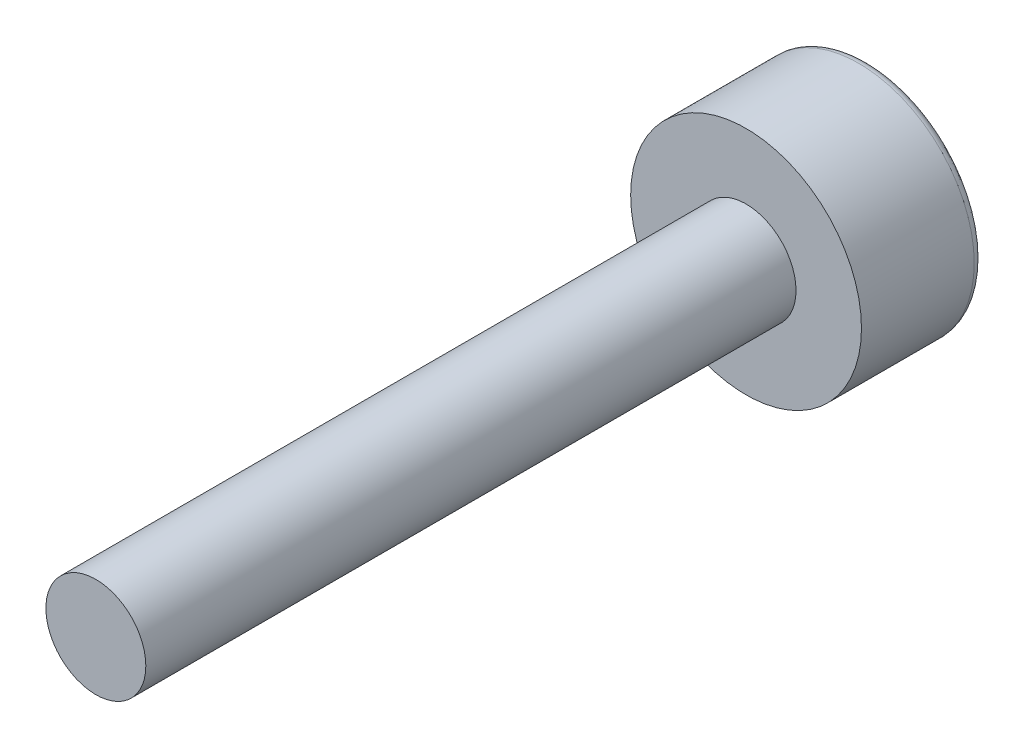
ISO-10303-21;
HEADER;
FILE_DESCRIPTION(('STEP AP214'),'2;1');
FILE_NAME('part.step','',(''),(''),'','','');
FILE_SCHEMA(('AUTOMOTIVE_DESIGN { 1 0 10303 214 1 1 1 1 }'));
ENDSEC;
DATA;
#1=APPLICATION_CONTEXT('core data for automotive mechanical design processes');
#2=APPLICATION_PROTOCOL_DEFINITION('international standard','automotive_design',2000,#1);
#3=PRODUCT_CONTEXT('',#1,'mechanical');
#4=PRODUCT('Part','Part','',(#3));
#5=PRODUCT_RELATED_PRODUCT_CATEGORY('part','',(#4));
#6=PRODUCT_DEFINITION_FORMATION('','',#4);
#7=PRODUCT_DEFINITION_CONTEXT('part definition',#1,'design');
#8=PRODUCT_DEFINITION('design','',#6,#7);
#9=PRODUCT_DEFINITION_SHAPE('','',#8);
#10=(LENGTH_UNIT() NAMED_UNIT(*) SI_UNIT(.MILLI.,.METRE.));
#11=(NAMED_UNIT(*) PLANE_ANGLE_UNIT() SI_UNIT($,.RADIAN.));
#12=(NAMED_UNIT(*) SI_UNIT($,.STERADIAN.) SOLID_ANGLE_UNIT());
#13=UNCERTAINTY_MEASURE_WITH_UNIT(LENGTH_MEASURE(1.E-05),#10,'distance_accuracy_value','');
#14=(GEOMETRIC_REPRESENTATION_CONTEXT(3) GLOBAL_UNCERTAINTY_ASSIGNED_CONTEXT((#13)) GLOBAL_UNIT_ASSIGNED_CONTEXT((#10,
#11,#12)) REPRESENTATION_CONTEXT('',''));
#15=CARTESIAN_POINT('',(0.,0.,0.));
#16=DIRECTION('',(0.,0.,1.));
#17=DIRECTION('',(1.,0.,0.));
#18=AXIS2_PLACEMENT_3D('',#15,#16,#17);
#19=CARTESIAN_POINT('',(1.443375672974,0.,-310.1));
#20=DIRECTION('',(0.,0.,1.));
#21=DIRECTION('',(0.,-1.,0.));
#22=AXIS2_PLACEMENT_3D('',#19,#20,#21);
#23=PLANE('',#22);
#24=DIRECTION('',(0.50000000000019,0.866025403784329,0.));
#25=VECTOR('',#24,1.);
#26=CARTESIAN_POINT('',(0.721687836487,-1.25,-310.1));
#27=LINE('',#26,#25);
#28=CARTESIAN_POINT('',(0.721687836487,-1.25,-310.1));
#29=VERTEX_POINT('',#28);
#30=CARTESIAN_POINT('',(1.443375672974,0.,-310.1));
#31=VERTEX_POINT('',#30);
#32=EDGE_CURVE('E177',#29,#31,#27,.T.);
#33=ORIENTED_EDGE('',*,*,#32,.F.);
#34=DIRECTION('',(1.,0.,0.));
#35=VECTOR('',#34,1.);
#36=CARTESIAN_POINT('',(-0.721687836487,-1.25,-310.1));
#37=LINE('',#36,#35);
#38=CARTESIAN_POINT('',(-0.721687836487,-1.25,-310.1));
#39=VERTEX_POINT('',#38);
#40=EDGE_CURVE('E83',#39,#29,#37,.T.);
#41=ORIENTED_EDGE('',*,*,#40,.F.);
#42=DIRECTION('',(0.50000000000019,-0.866025403784329,0.));
#43=VECTOR('',#42,1.);
#44=CARTESIAN_POINT('',(-1.443375672974,0.,-310.1));
#45=LINE('',#44,#43);
#46=CARTESIAN_POINT('',(-1.443375672974,0.,-310.1));
#47=VERTEX_POINT('',#46);
#48=EDGE_CURVE('E62',#47,#39,#45,.T.);
#49=ORIENTED_EDGE('',*,*,#48,.F.);
#50=DIRECTION('',(-0.50000000000019,-0.866025403784329,0.));
#51=VECTOR('',#50,1.);
#52=CARTESIAN_POINT('',(-0.721687836487,1.25,-310.1));
#53=LINE('',#52,#51);
#54=CARTESIAN_POINT('',(-0.721687836487,1.25,-310.1));
#55=VERTEX_POINT('',#54);
#56=EDGE_CURVE('E71',#55,#47,#53,.T.);
#57=ORIENTED_EDGE('',*,*,#56,.F.);
#58=DIRECTION('',(-1.,0.,0.));
#59=VECTOR('',#58,1.);
#60=CARTESIAN_POINT('',(0.721687836487,1.25,-310.1));
#61=LINE('',#60,#59);
#62=CARTESIAN_POINT('',(0.721687836487,1.25,-310.1));
#63=VERTEX_POINT('',#62);
#64=EDGE_CURVE('E25',#63,#55,#61,.T.);
#65=ORIENTED_EDGE('',*,*,#64,.F.);
#66=DIRECTION('',(-0.50000000000019,0.866025403784329,0.));
#67=VECTOR('',#66,1.);
#68=CARTESIAN_POINT('',(1.443375672974,0.,-310.1));
#69=LINE('',#68,#67);
#70=EDGE_CURVE('E11',#31,#63,#69,.T.);
#71=ORIENTED_EDGE('',*,*,#70,.F.);
#72=EDGE_LOOP('',(#33,#41,#49,#57,#65,#71));
#73=FACE_BOUND('',#72,.T.);
#74=ADVANCED_FACE('F16',(#73),#23,.F.);
#75=CARTESIAN_POINT('',(1.443375672974,0.,-310.1));
#76=DIRECTION('',(-0.866025403784329,-0.50000000000019,0.));
#77=DIRECTION('',(-0.50000000000019,0.866025403784329,0.));
#78=AXIS2_PLACEMENT_3D('',#75,#76,#77);
#79=PLANE('',#78);
#80=CARTESIAN_POINT('',(1.443375672974,0.,-311.4));
#81=CARTESIAN_POINT('',(1.443375672974,0.,-310.1));
#82=(BOUNDED_CURVE() B_SPLINE_CURVE(1,(#80,#81),.UNSPECIFIED.,.F.,
.F.) B_SPLINE_CURVE_WITH_KNOTS((2,2),(0.,1.),
.UNSPECIFIED.) CURVE() GEOMETRIC_REPRESENTATION_ITEM() RATIONAL_B_SPLINE_CURVE((1.,1.)) REPRESENTATION_ITEM(''));
#83=CARTESIAN_POINT('',(1.443375672974,0.,-311.4));
#84=VERTEX_POINT('',#83);
#85=EDGE_CURVE('E184',#84,#31,#82,.T.);
#86=ORIENTED_EDGE('',*,*,#85,.T.);
#87=ORIENTED_EDGE('',*,*,#70,.T.);
#88=CARTESIAN_POINT('',(0.721687836487,1.25,-311.4));
#89=CARTESIAN_POINT('',(0.721687836487,1.25,-310.1));
#90=(BOUNDED_CURVE() B_SPLINE_CURVE(1,(#88,#89),.UNSPECIFIED.,.F.,
.F.) B_SPLINE_CURVE_WITH_KNOTS((2,2),(0.,1.),
.UNSPECIFIED.) CURVE() GEOMETRIC_REPRESENTATION_ITEM() RATIONAL_B_SPLINE_CURVE((1.,1.)) REPRESENTATION_ITEM(''));
#91=CARTESIAN_POINT('',(0.721687836487,1.25,-311.4));
#92=VERTEX_POINT('',#91);
#93=EDGE_CURVE('E80',#92,#63,#90,.T.);
#94=ORIENTED_EDGE('',*,*,#93,.F.);
#95=DIRECTION('',(-0.50000000000019,0.866025403784329,0.));
#96=VECTOR('',#95,1.);
#97=CARTESIAN_POINT('',(1.443375672974,0.,-311.4));
#98=LINE('',#97,#96);
#99=EDGE_CURVE('E157',#84,#92,#98,.T.);
#100=ORIENTED_EDGE('',*,*,#99,.F.);
#101=EDGE_LOOP('',(#86,#87,#94,#100));
#102=FACE_BOUND('',#101,.T.);
#103=ADVANCED_FACE('F244',(#102),#79,.T.);
#104=CARTESIAN_POINT('',(0.721687836487,1.25,-310.1));
#105=DIRECTION('',(0.,-1.,0.));
#106=DIRECTION('',(-1.,0.,0.));
#107=AXIS2_PLACEMENT_3D('',#104,#105,#106);
#108=PLANE('',#107);
#109=ORIENTED_EDGE('',*,*,#93,.T.);
#110=ORIENTED_EDGE('',*,*,#64,.T.);
#111=CARTESIAN_POINT('',(-0.721687836487,1.25,-311.4));
#112=CARTESIAN_POINT('',(-0.721687836487,1.25,-310.1));
#113=(BOUNDED_CURVE() B_SPLINE_CURVE(1,(#111,#112),.UNSPECIFIED.,.F.,
.F.) B_SPLINE_CURVE_WITH_KNOTS((2,2),(0.,1.),
.UNSPECIFIED.) CURVE() GEOMETRIC_REPRESENTATION_ITEM() RATIONAL_B_SPLINE_CURVE((1.,1.)) REPRESENTATION_ITEM(''));
#114=CARTESIAN_POINT('',(-0.721687836487,1.25,-311.4));
#115=VERTEX_POINT('',#114);
#116=EDGE_CURVE('E77',#115,#55,#113,.T.);
#117=ORIENTED_EDGE('',*,*,#116,.F.);
#118=DIRECTION('',(-1.,0.,0.));
#119=VECTOR('',#118,1.);
#120=CARTESIAN_POINT('',(0.721687836487,1.25,-311.4));
#121=LINE('',#120,#119);
#122=EDGE_CURVE('E161',#92,#115,#121,.T.);
#123=ORIENTED_EDGE('',*,*,#122,.F.);
#124=EDGE_LOOP('',(#109,#110,#117,#123));
#125=FACE_BOUND('',#124,.T.);
#126=ADVANCED_FACE('F245',(#125),#108,.T.);
#127=CARTESIAN_POINT('',(-0.721687836487,1.25,-310.1));
#128=DIRECTION('',(0.866025403784329,-0.50000000000019,0.));
#129=DIRECTION('',(0.,0.,-1.));
#130=AXIS2_PLACEMENT_3D('',#127,#128,#129);
#131=PLANE('',#130);
#132=ORIENTED_EDGE('',*,*,#116,.T.);
#133=ORIENTED_EDGE('',*,*,#56,.T.);
#134=CARTESIAN_POINT('',(-1.443375672974,0.,-311.4));
#135=CARTESIAN_POINT('',(-1.443375672974,0.,-310.1));
#136=(BOUNDED_CURVE() B_SPLINE_CURVE(1,(#134,#135),.UNSPECIFIED.,.F.,
.F.) B_SPLINE_CURVE_WITH_KNOTS((2,2),(0.,1.),
.UNSPECIFIED.) CURVE() GEOMETRIC_REPRESENTATION_ITEM() RATIONAL_B_SPLINE_CURVE((1.,1.)) REPRESENTATION_ITEM(''));
#137=CARTESIAN_POINT('',(-1.443375672974,0.,-311.4));
#138=VERTEX_POINT('',#137);
#139=EDGE_CURVE('E74',#138,#47,#136,.T.);
#140=ORIENTED_EDGE('',*,*,#139,.F.);
#141=DIRECTION('',(-0.50000000000019,-0.866025403784329,0.));
#142=VECTOR('',#141,1.);
#143=CARTESIAN_POINT('',(-0.721687836487,1.25,-311.4));
#144=LINE('',#143,#142);
#145=EDGE_CURVE('E165',#115,#138,#144,.T.);
#146=ORIENTED_EDGE('',*,*,#145,.F.);
#147=EDGE_LOOP('',(#132,#133,#140,#146));
#148=FACE_BOUND('',#147,.T.);
#149=ADVANCED_FACE('F72',(#148),#131,.T.);
#150=CARTESIAN_POINT('',(-1.443375672974,0.,-310.1));
#151=DIRECTION('',(0.866025403784329,0.50000000000019,0.));
#152=DIRECTION('',(0.,0.,-1.));
#153=AXIS2_PLACEMENT_3D('',#150,#151,#152);
#154=PLANE('',#153);
#155=ORIENTED_EDGE('',*,*,#139,.T.);
#156=ORIENTED_EDGE('',*,*,#48,.T.);
#157=CARTESIAN_POINT('',(-0.721687836487,-1.25,-311.4));
#158=CARTESIAN_POINT('',(-0.721687836487,-1.25,-310.1));
#159=(BOUNDED_CURVE() B_SPLINE_CURVE(1,(#157,#158),.UNSPECIFIED.,.F.,
.F.) B_SPLINE_CURVE_WITH_KNOTS((2,2),(0.,1.),
.UNSPECIFIED.) CURVE() GEOMETRIC_REPRESENTATION_ITEM() RATIONAL_B_SPLINE_CURVE((1.,1.)) REPRESENTATION_ITEM(''));
#160=CARTESIAN_POINT('',(-0.721687836487,-1.25,-311.4));
#161=VERTEX_POINT('',#160);
#162=EDGE_CURVE('E95',#161,#39,#159,.T.);
#163=ORIENTED_EDGE('',*,*,#162,.F.);
#164=DIRECTION('',(0.50000000000019,-0.866025403784329,0.));
#165=VECTOR('',#164,1.);
#166=CARTESIAN_POINT('',(-1.443375672974,0.,-311.4));
#167=LINE('',#166,#165);
#168=EDGE_CURVE('E89',#138,#161,#167,.T.);
#169=ORIENTED_EDGE('',*,*,#168,.F.);
#170=EDGE_LOOP('',(#155,#156,#163,#169));
#171=FACE_BOUND('',#170,.T.);
#172=ADVANCED_FACE('F87',(#171),#154,.T.);
#173=CARTESIAN_POINT('',(-0.721687836487,-1.25,-310.1));
#174=DIRECTION('',(0.,1.,0.));
#175=DIRECTION('',(0.,0.,-1.));
#176=AXIS2_PLACEMENT_3D('',#173,#174,#175);
#177=PLANE('',#176);
#178=ORIENTED_EDGE('',*,*,#162,.T.);
#179=ORIENTED_EDGE('',*,*,#40,.T.);
#180=CARTESIAN_POINT('',(0.721687836487,-1.25,-311.4));
#181=CARTESIAN_POINT('',(0.721687836487,-1.25,-310.1));
#182=(BOUNDED_CURVE() B_SPLINE_CURVE(1,(#180,#181),.UNSPECIFIED.,.F.,
.F.) B_SPLINE_CURVE_WITH_KNOTS((2,2),(0.,1.),
.UNSPECIFIED.) CURVE() GEOMETRIC_REPRESENTATION_ITEM() RATIONAL_B_SPLINE_CURVE((1.,1.)) REPRESENTATION_ITEM(''));
#183=CARTESIAN_POINT('',(0.721687836487,-1.25,-311.4));
#184=VERTEX_POINT('',#183);
#185=EDGE_CURVE('E171',#184,#29,#182,.T.);
#186=ORIENTED_EDGE('',*,*,#185,.F.);
#187=DIRECTION('',(1.,0.,0.));
#188=VECTOR('',#187,1.);
#189=CARTESIAN_POINT('',(-0.721687836487,-1.25,-311.4));
#190=LINE('',#189,#188);
#191=EDGE_CURVE('E170',#161,#184,#190,.T.);
#192=ORIENTED_EDGE('',*,*,#191,.F.);
#193=EDGE_LOOP('',(#178,#179,#186,#192));
#194=FACE_BOUND('',#193,.T.);
#195=ADVANCED_FACE('F200',(#194),#177,.T.);
#196=CARTESIAN_POINT('',(0.721687836487,-1.25,-310.1));
#197=DIRECTION('',(-0.866025403784329,0.50000000000019,0.));
#198=DIRECTION('',(0.,0.,1.));
#199=AXIS2_PLACEMENT_3D('',#196,#197,#198);
#200=PLANE('',#199);
#201=ORIENTED_EDGE('',*,*,#185,.T.);
#202=ORIENTED_EDGE('',*,*,#32,.T.);
#203=ORIENTED_EDGE('',*,*,#85,.F.);
#204=DIRECTION('',(0.50000000000019,0.866025403784329,0.));
#205=VECTOR('',#204,1.);
#206=CARTESIAN_POINT('',(0.721687836487,-1.25,-311.4));
#207=LINE('',#206,#205);
#208=EDGE_CURVE('E150',#184,#84,#207,.T.);
#209=ORIENTED_EDGE('',*,*,#208,.F.);
#210=EDGE_LOOP('',(#201,#202,#203,#209));
#211=FACE_BOUND('',#210,.T.);
#212=ADVANCED_FACE('F243',(#211),#200,.T.);
#213=CARTESIAN_POINT('',(0.,0.,-311.4));
#214=DIRECTION('',(0.,0.,-1.));
#215=DIRECTION('',(0.,-1.,0.));
#216=AXIS2_PLACEMENT_3D('',#213,#214,#215);
#217=PLANE('',#216);
#218=ORIENTED_EDGE('',*,*,#208,.T.);
#219=ORIENTED_EDGE('',*,*,#99,.T.);
#220=ORIENTED_EDGE('',*,*,#122,.T.);
#221=ORIENTED_EDGE('',*,*,#145,.T.);
#222=ORIENTED_EDGE('',*,*,#168,.T.);
#223=ORIENTED_EDGE('',*,*,#191,.T.);
#224=EDGE_LOOP('',(#218,#219,#220,#221,#222,#223));
#225=FACE_BOUND('',#224,.T.);
#226=CARTESIAN_POINT('',(0.,0.,-311.4));
#227=DIRECTION('',(0.,0.,1.));
#228=DIRECTION('',(1.,0.,0.));
#229=AXIS2_PLACEMENT_3D('',#226,#227,#228);
#230=CIRCLE('',#229,2.615);
#231=CARTESIAN_POINT('',(2.615,0.,-311.4));
#232=VERTEX_POINT('',#231);
#233=EDGE_CURVE('E146',#232,#232,#230,.T.);
#234=ORIENTED_EDGE('',*,*,#233,.F.);
#235=EDGE_LOOP('',(#234));
#236=FACE_BOUND('',#235,.T.);
#237=ADVANCED_FACE('F208',(#225,#236),#217,.T.);
#238=CARTESIAN_POINT('',(0.,0.,-292.4));
#239=DIRECTION('',(0.,0.,-1.));
#240=DIRECTION('',(0.,-1.,0.));
#241=AXIS2_PLACEMENT_3D('',#238,#239,#240);
#242=PLANE('',#241);
#243=CARTESIAN_POINT('',(0.,0.,-292.4));
#244=DIRECTION('',(0.,0.,1.));
#245=DIRECTION('',(1.,0.,0.));
#246=AXIS2_PLACEMENT_3D('',#243,#244,#245);
#247=CIRCLE('',#246,1.229367061317);
#248=CARTESIAN_POINT('',(1.229367061317,0.,-292.4));
#249=VERTEX_POINT('',#248);
#250=EDGE_CURVE('E141',#249,#249,#247,.T.);
#251=ORIENTED_EDGE('',*,*,#250,.T.);
#252=EDGE_LOOP('',(#251));
#253=FACE_BOUND('',#252,.T.);
#254=ADVANCED_FACE('F317',(#253),#242,.F.);
#255=CARTESIAN_POINT('',(0.,0.,-311.175));
#256=DIRECTION('',(0.,0.,-1.));
#257=DIRECTION('',(1.,0.,0.));
#258=AXIS2_PLACEMENT_3D('',#255,#256,#257);
#259=TOROIDAL_SURFACE('',#258,2.615,0.225);
#260=CARTESIAN_POINT('',(2.615,0.,-311.175));
#261=DIRECTION('',(0.,1.,0.));
#262=DIRECTION('',(1.,0.,0.));
#263=AXIS2_PLACEMENT_3D('',#260,#261,#262);
#264=CIRCLE('',#263,0.225);
#265=CARTESIAN_POINT('',(2.84,0.,-311.175));
#266=VERTEX_POINT('',#265);
#267=EDGE_CURVE('E145',#266,#232,#264,.T.);
#268=ORIENTED_EDGE('',*,*,#267,.T.);
#269=ORIENTED_EDGE('',*,*,#233,.T.);
#270=ORIENTED_EDGE('',*,*,#267,.F.);
#271=CARTESIAN_POINT('',(0.,0.,-311.175));
#272=DIRECTION('',(0.,0.,1.));
#273=DIRECTION('',(1.,0.,0.));
#274=AXIS2_PLACEMENT_3D('',#271,#272,#273);
#275=CIRCLE('',#274,2.84);
#276=EDGE_CURVE('E133',#266,#266,#275,.T.);
#277=ORIENTED_EDGE('',*,*,#276,.F.);
#278=EDGE_LOOP('',(#268,#269,#270,#277));
#279=FACE_BOUND('',#278,.T.);
#280=ADVANCED_FACE('F327',(#279),#259,.T.);
#281=CARTESIAN_POINT('',(0.,0.,-292.4));
#282=DIRECTION('',(0.,0.,-1.));
#283=DIRECTION('',(1.,0.,0.));
#284=AXIS2_PLACEMENT_3D('',#281,#282,#283);
#285=CYLINDRICAL_SURFACE('',#284,1.229367061317);
#286=DIRECTION('',(0.,0.,-1.));
#287=VECTOR('',#286,1.);
#288=CARTESIAN_POINT('',(1.229367061317,0.,-292.4));
#289=LINE('',#288,#287);
#290=CARTESIAN_POINT('',(1.229367061317,0.,-308.4));
#291=VERTEX_POINT('',#290);
#292=EDGE_CURVE('E137',#249,#291,#289,.T.);
#293=ORIENTED_EDGE('',*,*,#292,.F.);
#294=ORIENTED_EDGE('',*,*,#250,.F.);
#295=ORIENTED_EDGE('',*,*,#292,.T.);
#296=CARTESIAN_POINT('',(0.,0.,-308.4));
#297=DIRECTION('',(0.,0.,1.));
#298=DIRECTION('',(1.,0.,0.));
#299=AXIS2_PLACEMENT_3D('',#296,#297,#298);
#300=CIRCLE('',#299,1.229367061317);
#301=EDGE_CURVE('E129',#291,#291,#300,.T.);
#302=ORIENTED_EDGE('',*,*,#301,.T.);
#303=EDGE_LOOP('',(#293,#294,#295,#302));
#304=FACE_BOUND('',#303,.T.);
#305=ADVANCED_FACE('F338',(#304),#285,.T.);
#306=CARTESIAN_POINT('',(0.,0.,-309.9));
#307=DIRECTION('',(0.,0.,-1.));
#308=DIRECTION('',(1.,0.,0.));
#309=AXIS2_PLACEMENT_3D('',#306,#307,#308);
#310=CYLINDRICAL_SURFACE('',#309,2.84);
#311=DIRECTION('',(0.,0.,-1.));
#312=VECTOR('',#311,1.);
#313=CARTESIAN_POINT('',(2.84,0.,-309.9));
#314=LINE('',#313,#312);
#315=CARTESIAN_POINT('',(2.84,0.,-308.4));
#316=VERTEX_POINT('',#315);
#317=EDGE_CURVE('E132',#316,#266,#314,.T.);
#318=ORIENTED_EDGE('',*,*,#317,.T.);
#319=ORIENTED_EDGE('',*,*,#276,.T.);
#320=ORIENTED_EDGE('',*,*,#317,.F.);
#321=CARTESIAN_POINT('',(0.,0.,-308.4));
#322=DIRECTION('',(0.,0.,1.));
#323=DIRECTION('',(1.,0.,0.));
#324=AXIS2_PLACEMENT_3D('',#321,#322,#323);
#325=CIRCLE('',#324,2.84);
#326=EDGE_CURVE('E127',#316,#316,#325,.T.);
#327=ORIENTED_EDGE('',*,*,#326,.F.);
#328=EDGE_LOOP('',(#318,#319,#320,#327));
#329=FACE_BOUND('',#328,.T.);
#330=ADVANCED_FACE('F349',(#329),#310,.T.);
#331=CARTESIAN_POINT('',(0.,0.,-308.4));
#332=DIRECTION('',(0.,0.,-1.));
#333=DIRECTION('',(0.,-1.,0.));
#334=AXIS2_PLACEMENT_3D('',#331,#332,#333);
#335=PLANE('',#334);
#336=ORIENTED_EDGE('',*,*,#301,.F.);
#337=EDGE_LOOP('',(#336));
#338=FACE_BOUND('',#337,.T.);
#339=ORIENTED_EDGE('',*,*,#326,.T.);
#340=EDGE_LOOP('',(#339));
#341=FACE_BOUND('',#340,.T.);
#342=ADVANCED_FACE('F360',(#338,#341),#335,.F.);
#343=CLOSED_SHELL('',(#74,#103,#126,#149,#172,#195,#212,#237,#254,#280,#305,#330,#342));
#344=MANIFOLD_SOLID_BREP('B1',#343);
#345=ADVANCED_BREP_SHAPE_REPRESENTATION('',(#18,#344),#14);
#346=SHAPE_DEFINITION_REPRESENTATION(#9,#345);
ENDSEC;
END-ISO-10303-21;
